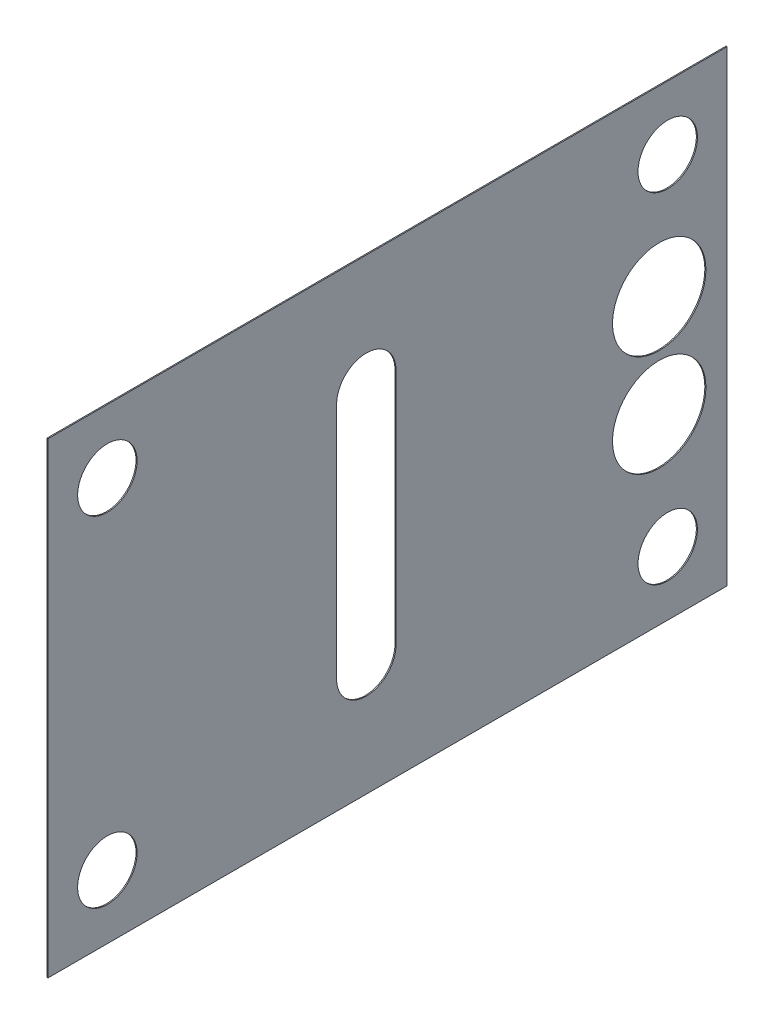
ISO-10303-21;
HEADER;
FILE_DESCRIPTION(('STEP AP214'),'2;1');
FILE_NAME('part.step','',(''),(''),'','','');
FILE_SCHEMA(('AUTOMOTIVE_DESIGN { 1 0 10303 214 1 1 1 1 }'));
ENDSEC;
DATA;
#1=APPLICATION_CONTEXT('core data for automotive mechanical design processes');
#2=APPLICATION_PROTOCOL_DEFINITION('international standard','automotive_design',2000,#1);
#3=PRODUCT_CONTEXT('',#1,'mechanical');
#4=PRODUCT('Part','Part','',(#3));
#5=PRODUCT_RELATED_PRODUCT_CATEGORY('part','',(#4));
#6=PRODUCT_DEFINITION_FORMATION('','',#4);
#7=PRODUCT_DEFINITION_CONTEXT('part definition',#1,'design');
#8=PRODUCT_DEFINITION('design','',#6,#7);
#9=PRODUCT_DEFINITION_SHAPE('','',#8);
#10=(LENGTH_UNIT() NAMED_UNIT(*) SI_UNIT(.MILLI.,.METRE.));
#11=(NAMED_UNIT(*) PLANE_ANGLE_UNIT() SI_UNIT($,.RADIAN.));
#12=(NAMED_UNIT(*) SI_UNIT($,.STERADIAN.) SOLID_ANGLE_UNIT());
#13=UNCERTAINTY_MEASURE_WITH_UNIT(LENGTH_MEASURE(1.E-05),#10,'distance_accuracy_value','');
#14=(GEOMETRIC_REPRESENTATION_CONTEXT(3) GLOBAL_UNCERTAINTY_ASSIGNED_CONTEXT((#13)) GLOBAL_UNIT_ASSIGNED_CONTEXT((#10,
#11,#12)) REPRESENTATION_CONTEXT('',''));
#15=CARTESIAN_POINT('',(0.,0.,0.));
#16=DIRECTION('',(0.,0.,1.));
#17=DIRECTION('',(1.,0.,0.));
#18=AXIS2_PLACEMENT_3D('',#15,#16,#17);
#19=CARTESIAN_POINT('',(0.254,55.,80.));
#20=DIRECTION('',(0.,0.,-1.));
#21=DIRECTION('',(-1.,0.,0.));
#22=AXIS2_PLACEMENT_3D('',#19,#20,#21);
#23=PLANE('',#22);
#24=DIRECTION('',(0.,-1.,0.));
#25=VECTOR('',#24,1.);
#26=CARTESIAN_POINT('',(0.,55.,80.));
#27=LINE('',#26,#25);
#28=CARTESIAN_POINT('',(0.,55.,80.));
#29=VERTEX_POINT('',#28);
#30=CARTESIAN_POINT('',(0.,-55.,80.));
#31=VERTEX_POINT('',#30);
#32=EDGE_CURVE('E161',#29,#31,#27,.T.);
#33=ORIENTED_EDGE('',*,*,#32,.T.);
#34=DIRECTION('',(-1.,0.,0.));
#35=VECTOR('',#34,1.);
#36=CARTESIAN_POINT('',(0.254,-55.,80.));
#37=LINE('',#36,#35);
#38=CARTESIAN_POINT('',(0.254,-55.,80.));
#39=VERTEX_POINT('',#38);
#40=EDGE_CURVE('E11',#39,#31,#37,.T.);
#41=ORIENTED_EDGE('',*,*,#40,.F.);
#42=DIRECTION('',(0.,-1.,0.));
#43=VECTOR('',#42,1.);
#44=CARTESIAN_POINT('',(0.254,55.,80.));
#45=LINE('',#44,#43);
#46=CARTESIAN_POINT('',(0.254,55.,80.));
#47=VERTEX_POINT('',#46);
#48=EDGE_CURVE('E162',#47,#39,#45,.T.);
#49=ORIENTED_EDGE('',*,*,#48,.F.);
#50=DIRECTION('',(-1.,0.,0.));
#51=VECTOR('',#50,1.);
#52=CARTESIAN_POINT('',(0.254,55.,80.));
#53=LINE('',#52,#51);
#54=EDGE_CURVE('E172',#47,#29,#53,.T.);
#55=ORIENTED_EDGE('',*,*,#54,.T.);
#56=EDGE_LOOP('',(#33,#41,#49,#55));
#57=FACE_BOUND('',#56,.T.);
#58=ADVANCED_FACE('F34',(#57),#23,.F.);
#59=CARTESIAN_POINT('',(0.254,-55.,80.));
#60=DIRECTION('',(0.,1.,0.));
#61=DIRECTION('',(0.,0.,1.));
#62=AXIS2_PLACEMENT_3D('',#59,#60,#61);
#63=PLANE('',#62);
#64=DIRECTION('',(0.,0.,-1.));
#65=VECTOR('',#64,1.);
#66=CARTESIAN_POINT('',(0.,-55.,80.));
#67=LINE('',#66,#65);
#68=CARTESIAN_POINT('',(0.,-55.,-80.));
#69=VERTEX_POINT('',#68);
#70=EDGE_CURVE('E175',#31,#69,#67,.T.);
#71=ORIENTED_EDGE('',*,*,#70,.T.);
#72=DIRECTION('',(-1.,0.,0.));
#73=VECTOR('',#72,1.);
#74=CARTESIAN_POINT('',(0.254,-55.,-80.));
#75=LINE('',#74,#73);
#76=CARTESIAN_POINT('',(0.254,-55.,-80.));
#77=VERTEX_POINT('',#76);
#78=EDGE_CURVE('E41',#77,#69,#75,.T.);
#79=ORIENTED_EDGE('',*,*,#78,.F.);
#80=DIRECTION('',(0.,0.,-1.));
#81=VECTOR('',#80,1.);
#82=CARTESIAN_POINT('',(0.254,-55.,80.));
#83=LINE('',#82,#81);
#84=EDGE_CURVE('E165',#39,#77,#83,.T.);
#85=ORIENTED_EDGE('',*,*,#84,.F.);
#86=ORIENTED_EDGE('',*,*,#40,.T.);
#87=EDGE_LOOP('',(#71,#79,#85,#86));
#88=FACE_BOUND('',#87,.T.);
#89=ADVANCED_FACE('F204',(#88),#63,.F.);
#90=CARTESIAN_POINT('',(0.254,55.,-80.));
#91=DIRECTION('',(0.,0.,1.));
#92=DIRECTION('',(0.,-1.,0.));
#93=AXIS2_PLACEMENT_3D('',#90,#91,#92);
#94=PLANE('',#93);
#95=DIRECTION('',(0.,1.,0.));
#96=VECTOR('',#95,1.);
#97=CARTESIAN_POINT('',(0.,55.,-80.));
#98=LINE('',#97,#96);
#99=CARTESIAN_POINT('',(0.,55.,-80.));
#100=VERTEX_POINT('',#99);
#101=EDGE_CURVE('E177',#69,#100,#98,.T.);
#102=ORIENTED_EDGE('',*,*,#101,.T.);
#103=DIRECTION('',(-1.,0.,0.));
#104=VECTOR('',#103,1.);
#105=CARTESIAN_POINT('',(0.254,55.,-80.));
#106=LINE('',#105,#104);
#107=CARTESIAN_POINT('',(0.254,55.,-80.));
#108=VERTEX_POINT('',#107);
#109=EDGE_CURVE('E182',#108,#100,#106,.T.);
#110=ORIENTED_EDGE('',*,*,#109,.F.);
#111=DIRECTION('',(0.,1.,0.));
#112=VECTOR('',#111,1.);
#113=CARTESIAN_POINT('',(0.254,55.,-80.));
#114=LINE('',#113,#112);
#115=EDGE_CURVE('E168',#77,#108,#114,.T.);
#116=ORIENTED_EDGE('',*,*,#115,.F.);
#117=ORIENTED_EDGE('',*,*,#78,.T.);
#118=EDGE_LOOP('',(#102,#110,#116,#117));
#119=FACE_BOUND('',#118,.T.);
#120=ADVANCED_FACE('F189',(#119),#94,.F.);
#121=CARTESIAN_POINT('',(0.254,55.,80.));
#122=DIRECTION('',(0.,-1.,0.));
#123=DIRECTION('',(0.,0.,-1.));
#124=AXIS2_PLACEMENT_3D('',#121,#122,#123);
#125=PLANE('',#124);
#126=DIRECTION('',(0.,0.,1.));
#127=VECTOR('',#126,1.);
#128=CARTESIAN_POINT('',(0.,55.,80.));
#129=LINE('',#128,#127);
#130=EDGE_CURVE('E166',#100,#29,#129,.T.);
#131=ORIENTED_EDGE('',*,*,#130,.T.);
#132=ORIENTED_EDGE('',*,*,#54,.F.);
#133=DIRECTION('',(0.,0.,1.));
#134=VECTOR('',#133,1.);
#135=CARTESIAN_POINT('',(0.254,55.,80.));
#136=LINE('',#135,#134);
#137=EDGE_CURVE('E170',#108,#47,#136,.T.);
#138=ORIENTED_EDGE('',*,*,#137,.F.);
#139=ORIENTED_EDGE('',*,*,#109,.T.);
#140=EDGE_LOOP('',(#131,#132,#138,#139));
#141=FACE_BOUND('',#140,.T.);
#142=ADVANCED_FACE('F197',(#141),#125,.F.);
#143=CARTESIAN_POINT('',(0.254,0.,0.));
#144=DIRECTION('',(1.,0.,0.));
#145=DIRECTION('',(0.,0.,-1.));
#146=AXIS2_PLACEMENT_3D('',#143,#144,#145);
#147=PLANE('',#146);
#148=CARTESIAN_POINT('',(0.254,12.,-64.));
#149=DIRECTION('',(1.,0.,0.));
#150=DIRECTION('',(0.,0.,-1.));
#151=AXIS2_PLACEMENT_3D('',#148,#149,#150);
#152=CIRCLE('',#151,11.);
#153=CARTESIAN_POINT('',(0.254,12.,-75.));
#154=VERTEX_POINT('',#153);
#155=EDGE_CURVE('E262',#154,#154,#152,.T.);
#156=ORIENTED_EDGE('',*,*,#155,.F.);
#157=EDGE_LOOP('',(#156));
#158=FACE_BOUND('',#157,.T.);
#159=CARTESIAN_POINT('',(0.254,-12.,-64.));
#160=DIRECTION('',(1.,0.,0.));
#161=DIRECTION('',(0.,0.,-1.));
#162=AXIS2_PLACEMENT_3D('',#159,#160,#161);
#163=CIRCLE('',#162,11.);
#164=CARTESIAN_POINT('',(0.254,-12.,-75.));
#165=VERTEX_POINT('',#164);
#166=EDGE_CURVE('E264',#165,#165,#163,.T.);
#167=ORIENTED_EDGE('',*,*,#166,.F.);
#168=EDGE_LOOP('',(#167));
#169=FACE_BOUND('',#168,.T.);
#170=CARTESIAN_POINT('',(0.254,28.,5.));
#171=DIRECTION('',(1.,0.,0.));
#172=DIRECTION('',(0.,0.,-1.));
#173=AXIS2_PLACEMENT_3D('',#170,#171,#172);
#174=CIRCLE('',#173,6.99999999999999);
#175=CARTESIAN_POINT('',(0.254,28.,-1.99999999999998));
#176=VERTEX_POINT('',#175);
#177=CARTESIAN_POINT('',(0.254,28.,12.));
#178=VERTEX_POINT('',#177);
#179=EDGE_CURVE('E48',#176,#178,#174,.T.);
#180=ORIENTED_EDGE('',*,*,#179,.F.);
#181=DIRECTION('',(0.,1.,0.));
#182=VECTOR('',#181,1.);
#183=CARTESIAN_POINT('',(0.254,28.,-1.99999999999998));
#184=LINE('',#183,#182);
#185=CARTESIAN_POINT('',(0.254,-28.,-2.));
#186=VERTEX_POINT('',#185);
#187=EDGE_CURVE('E116',#186,#176,#184,.T.);
#188=ORIENTED_EDGE('',*,*,#187,.F.);
#189=CARTESIAN_POINT('',(0.254,-28.,5.));
#190=DIRECTION('',(1.,0.,0.));
#191=DIRECTION('',(0.,0.,-1.));
#192=AXIS2_PLACEMENT_3D('',#189,#190,#191);
#193=CIRCLE('',#192,7.);
#194=CARTESIAN_POINT('',(0.254,-28.,12.));
#195=VERTEX_POINT('',#194);
#196=EDGE_CURVE('E119',#195,#186,#193,.T.);
#197=ORIENTED_EDGE('',*,*,#196,.F.);
#198=DIRECTION('',(0.,-1.,0.));
#199=VECTOR('',#198,1.);
#200=CARTESIAN_POINT('',(0.254,28.,12.));
#201=LINE('',#200,#199);
#202=EDGE_CURVE('E128',#178,#195,#201,.T.);
#203=ORIENTED_EDGE('',*,*,#202,.F.);
#204=EDGE_LOOP('',(#180,#188,#197,#203));
#205=FACE_BOUND('',#204,.T.);
#206=CARTESIAN_POINT('',(0.254,40.,66.));
#207=DIRECTION('',(1.,0.,0.));
#208=DIRECTION('',(0.,0.,-1.));
#209=AXIS2_PLACEMENT_3D('',#206,#207,#208);
#210=CIRCLE('',#209,7.);
#211=CARTESIAN_POINT('',(0.254,40.,59.));
#212=VERTEX_POINT('',#211);
#213=EDGE_CURVE('E134',#212,#212,#210,.T.);
#214=ORIENTED_EDGE('',*,*,#213,.F.);
#215=EDGE_LOOP('',(#214));
#216=FACE_BOUND('',#215,.T.);
#217=CARTESIAN_POINT('',(0.254,40.,-66.));
#218=DIRECTION('',(1.,0.,0.));
#219=DIRECTION('',(0.,0.,-1.));
#220=AXIS2_PLACEMENT_3D('',#217,#218,#219);
#221=CIRCLE('',#220,7.);
#222=CARTESIAN_POINT('',(0.254,40.,-73.));
#223=VERTEX_POINT('',#222);
#224=EDGE_CURVE('E143',#223,#223,#221,.T.);
#225=ORIENTED_EDGE('',*,*,#224,.F.);
#226=EDGE_LOOP('',(#225));
#227=FACE_BOUND('',#226,.T.);
#228=CARTESIAN_POINT('',(0.254,-40.,-66.));
#229=DIRECTION('',(1.,0.,0.));
#230=DIRECTION('',(0.,0.,-1.));
#231=AXIS2_PLACEMENT_3D('',#228,#229,#230);
#232=CIRCLE('',#231,7.);
#233=CARTESIAN_POINT('',(0.254,-40.,-73.));
#234=VERTEX_POINT('',#233);
#235=EDGE_CURVE('E149',#234,#234,#232,.T.);
#236=ORIENTED_EDGE('',*,*,#235,.F.);
#237=EDGE_LOOP('',(#236));
#238=FACE_BOUND('',#237,.T.);
#239=CARTESIAN_POINT('',(0.254,-40.,66.));
#240=DIRECTION('',(1.,0.,0.));
#241=DIRECTION('',(0.,0.,-1.));
#242=AXIS2_PLACEMENT_3D('',#239,#240,#241);
#243=CIRCLE('',#242,7.);
#244=CARTESIAN_POINT('',(0.254,-40.,59.));
#245=VERTEX_POINT('',#244);
#246=EDGE_CURVE('E155',#245,#245,#243,.T.);
#247=ORIENTED_EDGE('',*,*,#246,.F.);
#248=EDGE_LOOP('',(#247));
#249=FACE_BOUND('',#248,.T.);
#250=ORIENTED_EDGE('',*,*,#48,.T.);
#251=ORIENTED_EDGE('',*,*,#84,.T.);
#252=ORIENTED_EDGE('',*,*,#115,.T.);
#253=ORIENTED_EDGE('',*,*,#137,.T.);
#254=EDGE_LOOP('',(#250,#251,#252,#253));
#255=FACE_BOUND('',#254,.T.);
#256=ADVANCED_FACE('F203',(#158,#169,#205,#216,#227,#238,#249,#255),#147,.T.);
#257=CARTESIAN_POINT('',(0.,0.,0.));
#258=DIRECTION('',(1.,0.,0.));
#259=DIRECTION('',(0.,0.,-1.));
#260=AXIS2_PLACEMENT_3D('',#257,#258,#259);
#261=PLANE('',#260);
#262=CARTESIAN_POINT('',(0.,12.,-64.));
#263=DIRECTION('',(1.,0.,0.));
#264=DIRECTION('',(0.,0.,-1.));
#265=AXIS2_PLACEMENT_3D('',#262,#263,#264);
#266=CIRCLE('',#265,11.);
#267=CARTESIAN_POINT('',(0.,12.,-75.));
#268=VERTEX_POINT('',#267);
#269=EDGE_CURVE('E259',#268,#268,#266,.T.);
#270=ORIENTED_EDGE('',*,*,#269,.T.);
#271=EDGE_LOOP('',(#270));
#272=FACE_BOUND('',#271,.T.);
#273=CARTESIAN_POINT('',(0.,-12.,-64.));
#274=DIRECTION('',(1.,0.,0.));
#275=DIRECTION('',(0.,0.,-1.));
#276=AXIS2_PLACEMENT_3D('',#273,#274,#275);
#277=CIRCLE('',#276,11.);
#278=CARTESIAN_POINT('',(0.,-12.,-75.));
#279=VERTEX_POINT('',#278);
#280=EDGE_CURVE('E122',#279,#279,#277,.T.);
#281=ORIENTED_EDGE('',*,*,#280,.T.);
#282=EDGE_LOOP('',(#281));
#283=FACE_BOUND('',#282,.T.);
#284=DIRECTION('',(0.,1.,0.));
#285=VECTOR('',#284,1.);
#286=CARTESIAN_POINT('',(0.,28.,-1.99999999999998));
#287=LINE('',#286,#285);
#288=CARTESIAN_POINT('',(0.,-28.,-2.));
#289=VERTEX_POINT('',#288);
#290=CARTESIAN_POINT('',(0.,28.,-1.99999999999998));
#291=VERTEX_POINT('',#290);
#292=EDGE_CURVE('E106',#289,#291,#287,.T.);
#293=ORIENTED_EDGE('',*,*,#292,.T.);
#294=CARTESIAN_POINT('',(0.,28.,5.));
#295=DIRECTION('',(1.,0.,0.));
#296=DIRECTION('',(0.,0.,-1.));
#297=AXIS2_PLACEMENT_3D('',#294,#295,#296);
#298=CIRCLE('',#297,6.99999999999999);
#299=CARTESIAN_POINT('',(0.,28.,12.));
#300=VERTEX_POINT('',#299);
#301=EDGE_CURVE('E100',#291,#300,#298,.T.);
#302=ORIENTED_EDGE('',*,*,#301,.T.);
#303=DIRECTION('',(0.,-1.,0.));
#304=VECTOR('',#303,1.);
#305=CARTESIAN_POINT('',(0.,28.,12.));
#306=LINE('',#305,#304);
#307=CARTESIAN_POINT('',(0.,-28.,12.));
#308=VERTEX_POINT('',#307);
#309=EDGE_CURVE('E109',#300,#308,#306,.T.);
#310=ORIENTED_EDGE('',*,*,#309,.T.);
#311=CARTESIAN_POINT('',(0.,-28.,5.));
#312=DIRECTION('',(1.,0.,0.));
#313=DIRECTION('',(0.,0.,-1.));
#314=AXIS2_PLACEMENT_3D('',#311,#312,#313);
#315=CIRCLE('',#314,7.);
#316=EDGE_CURVE('E56',#308,#289,#315,.T.);
#317=ORIENTED_EDGE('',*,*,#316,.T.);
#318=EDGE_LOOP('',(#293,#302,#310,#317));
#319=FACE_BOUND('',#318,.T.);
#320=CARTESIAN_POINT('',(0.,40.,66.));
#321=DIRECTION('',(1.,0.,0.));
#322=DIRECTION('',(0.,0.,-1.));
#323=AXIS2_PLACEMENT_3D('',#320,#321,#322);
#324=CIRCLE('',#323,7.);
#325=CARTESIAN_POINT('',(0.,40.,59.));
#326=VERTEX_POINT('',#325);
#327=EDGE_CURVE('E140',#326,#326,#324,.T.);
#328=ORIENTED_EDGE('',*,*,#327,.T.);
#329=EDGE_LOOP('',(#328));
#330=FACE_BOUND('',#329,.T.);
#331=CARTESIAN_POINT('',(0.,40.,-66.));
#332=DIRECTION('',(1.,0.,0.));
#333=DIRECTION('',(0.,0.,-1.));
#334=AXIS2_PLACEMENT_3D('',#331,#332,#333);
#335=CIRCLE('',#334,7.);
#336=CARTESIAN_POINT('',(0.,40.,-73.));
#337=VERTEX_POINT('',#336);
#338=EDGE_CURVE('E146',#337,#337,#335,.T.);
#339=ORIENTED_EDGE('',*,*,#338,.T.);
#340=EDGE_LOOP('',(#339));
#341=FACE_BOUND('',#340,.T.);
#342=CARTESIAN_POINT('',(0.,-40.,-66.));
#343=DIRECTION('',(1.,0.,0.));
#344=DIRECTION('',(0.,0.,-1.));
#345=AXIS2_PLACEMENT_3D('',#342,#343,#344);
#346=CIRCLE('',#345,7.);
#347=CARTESIAN_POINT('',(0.,-40.,-73.));
#348=VERTEX_POINT('',#347);
#349=EDGE_CURVE('E152',#348,#348,#346,.T.);
#350=ORIENTED_EDGE('',*,*,#349,.T.);
#351=EDGE_LOOP('',(#350));
#352=FACE_BOUND('',#351,.T.);
#353=CARTESIAN_POINT('',(0.,-40.,66.));
#354=DIRECTION('',(1.,0.,0.));
#355=DIRECTION('',(0.,0.,-1.));
#356=AXIS2_PLACEMENT_3D('',#353,#354,#355);
#357=CIRCLE('',#356,7.);
#358=CARTESIAN_POINT('',(0.,-40.,59.));
#359=VERTEX_POINT('',#358);
#360=EDGE_CURVE('E158',#359,#359,#357,.T.);
#361=ORIENTED_EDGE('',*,*,#360,.T.);
#362=EDGE_LOOP('',(#361));
#363=FACE_BOUND('',#362,.T.);
#364=ORIENTED_EDGE('',*,*,#32,.F.);
#365=ORIENTED_EDGE('',*,*,#130,.F.);
#366=ORIENTED_EDGE('',*,*,#101,.F.);
#367=ORIENTED_EDGE('',*,*,#70,.F.);
#368=EDGE_LOOP('',(#364,#365,#366,#367));
#369=FACE_BOUND('',#368,.T.);
#370=ADVANCED_FACE('F113',(#272,#283,#319,#330,#341,#352,#363,#369),#261,.F.);
#371=CARTESIAN_POINT('',(0.254,-40.,66.));
#372=DIRECTION('',(1.,0.,0.));
#373=DIRECTION('',(0.,0.,-1.));
#374=AXIS2_PLACEMENT_3D('',#371,#372,#373);
#375=CYLINDRICAL_SURFACE('',#374,7.);
#376=ORIENTED_EDGE('',*,*,#360,.F.);
#377=EDGE_LOOP('',(#376));
#378=FACE_BOUND('',#377,.T.);
#379=ORIENTED_EDGE('',*,*,#246,.T.);
#380=EDGE_LOOP('',(#379));
#381=FACE_BOUND('',#380,.T.);
#382=ADVANCED_FACE('F216',(#378,#381),#375,.F.);
#383=CARTESIAN_POINT('',(0.254,-40.,-66.));
#384=DIRECTION('',(1.,0.,0.));
#385=DIRECTION('',(0.,0.,-1.));
#386=AXIS2_PLACEMENT_3D('',#383,#384,#385);
#387=CYLINDRICAL_SURFACE('',#386,7.);
#388=ORIENTED_EDGE('',*,*,#349,.F.);
#389=EDGE_LOOP('',(#388));
#390=FACE_BOUND('',#389,.T.);
#391=ORIENTED_EDGE('',*,*,#235,.T.);
#392=EDGE_LOOP('',(#391));
#393=FACE_BOUND('',#392,.T.);
#394=ADVANCED_FACE('F223',(#390,#393),#387,.F.);
#395=CARTESIAN_POINT('',(0.254,40.,-66.));
#396=DIRECTION('',(1.,0.,0.));
#397=DIRECTION('',(0.,0.,-1.));
#398=AXIS2_PLACEMENT_3D('',#395,#396,#397);
#399=CYLINDRICAL_SURFACE('',#398,7.);
#400=ORIENTED_EDGE('',*,*,#338,.F.);
#401=EDGE_LOOP('',(#400));
#402=FACE_BOUND('',#401,.T.);
#403=ORIENTED_EDGE('',*,*,#224,.T.);
#404=EDGE_LOOP('',(#403));
#405=FACE_BOUND('',#404,.T.);
#406=ADVANCED_FACE('F227',(#402,#405),#399,.F.);
#407=CARTESIAN_POINT('',(0.254,40.,66.));
#408=DIRECTION('',(1.,0.,0.));
#409=DIRECTION('',(0.,0.,-1.));
#410=AXIS2_PLACEMENT_3D('',#407,#408,#409);
#411=CYLINDRICAL_SURFACE('',#410,7.);
#412=ORIENTED_EDGE('',*,*,#327,.F.);
#413=EDGE_LOOP('',(#412));
#414=FACE_BOUND('',#413,.T.);
#415=ORIENTED_EDGE('',*,*,#213,.T.);
#416=EDGE_LOOP('',(#415));
#417=FACE_BOUND('',#416,.T.);
#418=ADVANCED_FACE('F231',(#414,#417),#411,.F.);
#419=CARTESIAN_POINT('',(0.,28.,5.));
#420=DIRECTION('',(1.,0.,0.));
#421=DIRECTION('',(0.,0.,-1.));
#422=AXIS2_PLACEMENT_3D('',#419,#420,#421);
#423=CYLINDRICAL_SURFACE('',#422,6.99999999999999);
#424=ORIENTED_EDGE('',*,*,#179,.T.);
#425=DIRECTION('',(1.,0.,0.));
#426=VECTOR('',#425,1.);
#427=CARTESIAN_POINT('',(0.,28.,12.));
#428=LINE('',#427,#426);
#429=EDGE_CURVE('E96',#300,#178,#428,.T.);
#430=ORIENTED_EDGE('',*,*,#429,.F.);
#431=ORIENTED_EDGE('',*,*,#301,.F.);
#432=DIRECTION('',(1.,0.,0.));
#433=VECTOR('',#432,1.);
#434=CARTESIAN_POINT('',(0.,28.,-1.99999999999998));
#435=LINE('',#434,#433);
#436=EDGE_CURVE('E132',#291,#176,#435,.T.);
#437=ORIENTED_EDGE('',*,*,#436,.T.);
#438=EDGE_LOOP('',(#424,#430,#431,#437));
#439=FACE_BOUND('',#438,.T.);
#440=ADVANCED_FACE('F98',(#439),#423,.F.);
#441=CARTESIAN_POINT('',(0.,28.,-1.99999999999998));
#442=DIRECTION('',(0.,0.,-1.));
#443=DIRECTION('',(0.,1.,0.));
#444=AXIS2_PLACEMENT_3D('',#441,#442,#443);
#445=PLANE('',#444);
#446=ORIENTED_EDGE('',*,*,#187,.T.);
#447=ORIENTED_EDGE('',*,*,#436,.F.);
#448=ORIENTED_EDGE('',*,*,#292,.F.);
#449=DIRECTION('',(1.,0.,0.));
#450=VECTOR('',#449,1.);
#451=CARTESIAN_POINT('',(0.,-28.,-2.));
#452=LINE('',#451,#450);
#453=EDGE_CURVE('E135',#289,#186,#452,.T.);
#454=ORIENTED_EDGE('',*,*,#453,.T.);
#455=EDGE_LOOP('',(#446,#447,#448,#454));
#456=FACE_BOUND('',#455,.T.);
#457=ADVANCED_FACE('F238',(#456),#445,.F.);
#458=CARTESIAN_POINT('',(0.,-28.,5.));
#459=DIRECTION('',(1.,0.,0.));
#460=DIRECTION('',(0.,0.,-1.));
#461=AXIS2_PLACEMENT_3D('',#458,#459,#460);
#462=CYLINDRICAL_SURFACE('',#461,7.);
#463=ORIENTED_EDGE('',*,*,#196,.T.);
#464=ORIENTED_EDGE('',*,*,#453,.F.);
#465=ORIENTED_EDGE('',*,*,#316,.F.);
#466=DIRECTION('',(1.,0.,0.));
#467=VECTOR('',#466,1.);
#468=CARTESIAN_POINT('',(0.,-28.,12.));
#469=LINE('',#468,#467);
#470=EDGE_CURVE('E105',#308,#195,#469,.T.);
#471=ORIENTED_EDGE('',*,*,#470,.T.);
#472=EDGE_LOOP('',(#463,#464,#465,#471));
#473=FACE_BOUND('',#472,.T.);
#474=ADVANCED_FACE('F242',(#473),#462,.F.);
#475=CARTESIAN_POINT('',(0.,28.,12.));
#476=DIRECTION('',(0.,0.,1.));
#477=DIRECTION('',(1.,0.,0.));
#478=AXIS2_PLACEMENT_3D('',#475,#476,#477);
#479=PLANE('',#478);
#480=ORIENTED_EDGE('',*,*,#202,.T.);
#481=ORIENTED_EDGE('',*,*,#470,.F.);
#482=ORIENTED_EDGE('',*,*,#309,.F.);
#483=ORIENTED_EDGE('',*,*,#429,.T.);
#484=EDGE_LOOP('',(#480,#481,#482,#483));
#485=FACE_BOUND('',#484,.T.);
#486=ADVANCED_FACE('F110',(#485),#479,.F.);
#487=CARTESIAN_POINT('',(0.254,-12.,-64.));
#488=DIRECTION('',(1.,0.,0.));
#489=DIRECTION('',(0.,0.,-1.));
#490=AXIS2_PLACEMENT_3D('',#487,#488,#489);
#491=CYLINDRICAL_SURFACE('',#490,11.);
#492=ORIENTED_EDGE('',*,*,#280,.F.);
#493=EDGE_LOOP('',(#492));
#494=FACE_BOUND('',#493,.T.);
#495=ORIENTED_EDGE('',*,*,#166,.T.);
#496=EDGE_LOOP('',(#495));
#497=FACE_BOUND('',#496,.T.);
#498=ADVANCED_FACE('F241',(#494,#497),#491,.F.);
#499=CARTESIAN_POINT('',(0.254,12.,-64.));
#500=DIRECTION('',(1.,0.,0.));
#501=DIRECTION('',(0.,0.,-1.));
#502=AXIS2_PLACEMENT_3D('',#499,#500,#501);
#503=CYLINDRICAL_SURFACE('',#502,11.);
#504=ORIENTED_EDGE('',*,*,#269,.F.);
#505=EDGE_LOOP('',(#504));
#506=FACE_BOUND('',#505,.T.);
#507=ORIENTED_EDGE('',*,*,#155,.T.);
#508=EDGE_LOOP('',(#507));
#509=FACE_BOUND('',#508,.T.);
#510=ADVANCED_FACE('F250',(#506,#509),#503,.F.);
#511=CLOSED_SHELL('',(#58,#89,#120,#142,#256,#370,#382,#394,#406,#418,#440,#457,#474,#486,#498,#510));
#512=MANIFOLD_SOLID_BREP('B2',#511);
#513=ADVANCED_BREP_SHAPE_REPRESENTATION('',(#18,#512),#14);
#514=SHAPE_DEFINITION_REPRESENTATION(#9,#513);
ENDSEC;
END-ISO-10303-21;
